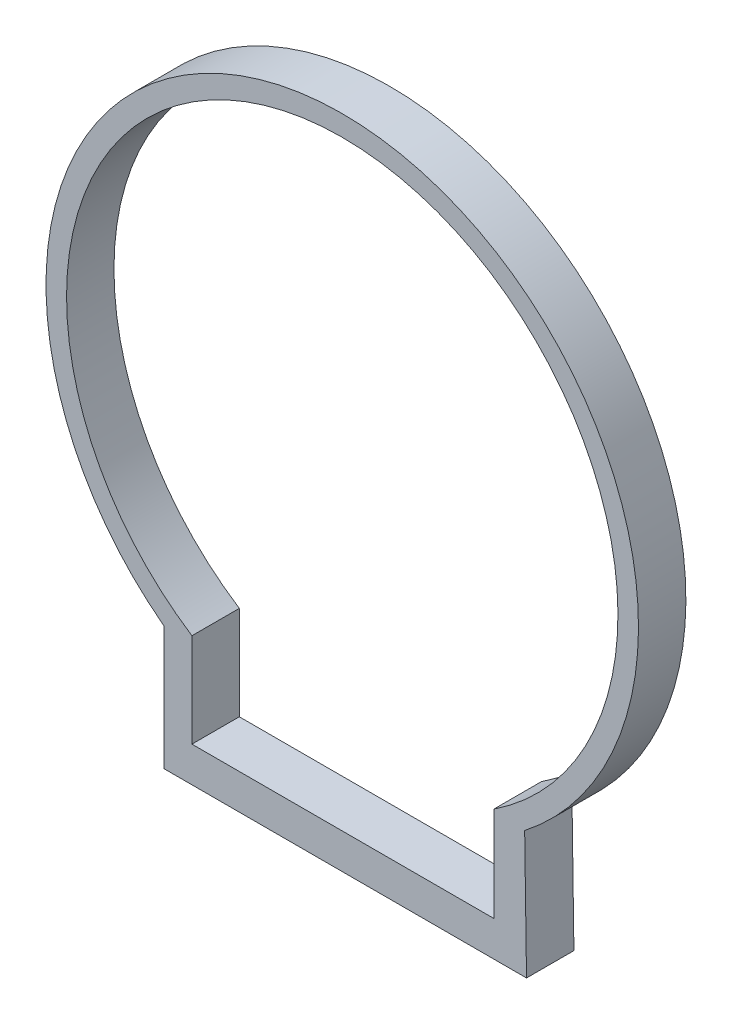
ISO-10303-21;
HEADER;
FILE_DESCRIPTION(('STEP AP214'),'2;1');
FILE_NAME('part.step','',(''),(''),'','','');
FILE_SCHEMA(('AUTOMOTIVE_DESIGN { 1 0 10303 214 1 1 1 1 }'));
ENDSEC;
DATA;
#1=APPLICATION_CONTEXT('core data for automotive mechanical design processes');
#2=APPLICATION_PROTOCOL_DEFINITION('international standard','automotive_design',2000,#1);
#3=PRODUCT_CONTEXT('',#1,'mechanical');
#4=PRODUCT('Part','Part','',(#3));
#5=PRODUCT_RELATED_PRODUCT_CATEGORY('part','',(#4));
#6=PRODUCT_DEFINITION_FORMATION('','',#4);
#7=PRODUCT_DEFINITION_CONTEXT('part definition',#1,'design');
#8=PRODUCT_DEFINITION('design','',#6,#7);
#9=PRODUCT_DEFINITION_SHAPE('','',#8);
#10=(LENGTH_UNIT() NAMED_UNIT(*) SI_UNIT(.MILLI.,.METRE.));
#11=(NAMED_UNIT(*) PLANE_ANGLE_UNIT() SI_UNIT($,.RADIAN.));
#12=(NAMED_UNIT(*) SI_UNIT($,.STERADIAN.) SOLID_ANGLE_UNIT());
#13=UNCERTAINTY_MEASURE_WITH_UNIT(LENGTH_MEASURE(1.E-05),#10,'distance_accuracy_value','');
#14=(GEOMETRIC_REPRESENTATION_CONTEXT(3) GLOBAL_UNCERTAINTY_ASSIGNED_CONTEXT((#13)) GLOBAL_UNIT_ASSIGNED_CONTEXT((#10,
#11,#12)) REPRESENTATION_CONTEXT('',''));
#15=CARTESIAN_POINT('',(0.,0.,0.));
#16=DIRECTION('',(0.,0.,1.));
#17=DIRECTION('',(1.,0.,0.));
#18=AXIS2_PLACEMENT_3D('',#15,#16,#17);
#19=CARTESIAN_POINT('',(0.,0.,3.));
#20=DIRECTION('',(0.,0.,-1.));
#21=DIRECTION('',(-1.,0.,0.));
#22=AXIS2_PLACEMENT_3D('',#19,#20,#21);
#23=CYLINDRICAL_SURFACE('',#22,18.75);
#24=CARTESIAN_POINT('',(0.,0.,0.));
#25=DIRECTION('',(0.,0.,1.));
#26=DIRECTION('',(-1.,0.,0.));
#27=AXIS2_PLACEMENT_3D('',#24,#25,#26);
#28=CIRCLE('',#27,18.75);
#29=CARTESIAN_POINT('',(11.5453145629285,-14.773903060567,0.));
#30=VERTEX_POINT('',#29);
#31=CARTESIAN_POINT('',(-11.287222979962,-14.9720104662205,0.));
#32=VERTEX_POINT('',#31);
#33=EDGE_CURVE('E124',#30,#32,#28,.T.);
#34=ORIENTED_EDGE('',*,*,#33,.T.);
#35=DIRECTION('',(0.,0.,-1.));
#36=VECTOR('',#35,1.);
#37=CARTESIAN_POINT('',(-11.287222979962,-14.9720104662205,3.));
#38=LINE('',#37,#36);
#39=CARTESIAN_POINT('',(-11.287222979962,-14.9720104662205,3.));
#40=VERTEX_POINT('',#39);
#41=EDGE_CURVE('E11',#40,#32,#38,.T.);
#42=ORIENTED_EDGE('',*,*,#41,.F.);
#43=CARTESIAN_POINT('',(0.,0.,3.));
#44=DIRECTION('',(0.,0.,1.));
#45=DIRECTION('',(-1.,0.,0.));
#46=AXIS2_PLACEMENT_3D('',#43,#44,#45);
#47=CIRCLE('',#46,18.75);
#48=CARTESIAN_POINT('',(11.5453145629285,-14.773903060567,3.));
#49=VERTEX_POINT('',#48);
#50=EDGE_CURVE('E156',#49,#40,#47,.T.);
#51=ORIENTED_EDGE('',*,*,#50,.F.);
#52=DIRECTION('',(0.,0.,-1.));
#53=VECTOR('',#52,1.);
#54=CARTESIAN_POINT('',(11.5453145629285,-14.773903060567,3.));
#55=LINE('',#54,#53);
#56=EDGE_CURVE('E170',#49,#30,#55,.T.);
#57=ORIENTED_EDGE('',*,*,#56,.T.);
#58=EDGE_LOOP('',(#34,#42,#51,#57));
#59=FACE_BOUND('',#58,.T.);
#60=ADVANCED_FACE('F41',(#59),#23,.T.);
#61=CARTESIAN_POINT('',(-11.287222979962,-14.9720104662205,3.));
#62=DIRECTION('',(1.,0.,0.));
#63=DIRECTION('',(0.,0.,-1.));
#64=AXIS2_PLACEMENT_3D('',#61,#62,#63);
#65=PLANE('',#64);
#66=DIRECTION('',(0.,-1.,0.));
#67=VECTOR('',#66,1.);
#68=CARTESIAN_POINT('',(-11.287222979962,-14.9720104662205,0.));
#69=LINE('',#68,#67);
#70=CARTESIAN_POINT('',(-11.287222979962,-22.8,0.));
#71=VERTEX_POINT('',#70);
#72=EDGE_CURVE('E174',#32,#71,#69,.T.);
#73=ORIENTED_EDGE('',*,*,#72,.T.);
#74=DIRECTION('',(0.,0.,-1.));
#75=VECTOR('',#74,1.);
#76=CARTESIAN_POINT('',(-11.287222979962,-22.8,3.));
#77=LINE('',#76,#75);
#78=CARTESIAN_POINT('',(-11.287222979962,-22.8,3.));
#79=VERTEX_POINT('',#78);
#80=EDGE_CURVE('E49',#79,#71,#77,.T.);
#81=ORIENTED_EDGE('',*,*,#80,.F.);
#82=DIRECTION('',(0.,-1.,0.));
#83=VECTOR('',#82,1.);
#84=CARTESIAN_POINT('',(-11.287222979962,-14.9720104662205,3.));
#85=LINE('',#84,#83);
#86=EDGE_CURVE('E160',#40,#79,#85,.T.);
#87=ORIENTED_EDGE('',*,*,#86,.F.);
#88=ORIENTED_EDGE('',*,*,#41,.T.);
#89=EDGE_LOOP('',(#73,#81,#87,#88));
#90=FACE_BOUND('',#89,.T.);
#91=ADVANCED_FACE('F197',(#90),#65,.F.);
#92=CARTESIAN_POINT('',(11.662777020038,-22.8,3.));
#93=DIRECTION('',(0.,1.,0.));
#94=DIRECTION('',(-1.,0.,0.));
#95=AXIS2_PLACEMENT_3D('',#92,#93,#94);
#96=PLANE('',#95);
#97=DIRECTION('',(1.,0.,0.));
#98=VECTOR('',#97,1.);
#99=CARTESIAN_POINT('',(11.662777020038,-22.8,0.));
#100=LINE('',#99,#98);
#101=CARTESIAN_POINT('',(11.662777020038,-22.8,0.));
#102=VERTEX_POINT('',#101);
#103=EDGE_CURVE('E178',#71,#102,#100,.T.);
#104=ORIENTED_EDGE('',*,*,#103,.T.);
#105=DIRECTION('',(0.,0.,-1.));
#106=VECTOR('',#105,1.);
#107=CARTESIAN_POINT('',(11.662777020038,-22.8,3.));
#108=LINE('',#107,#106);
#109=CARTESIAN_POINT('',(11.662777020038,-22.8,3.));
#110=VERTEX_POINT('',#109);
#111=EDGE_CURVE('E186',#110,#102,#108,.T.);
#112=ORIENTED_EDGE('',*,*,#111,.F.);
#113=DIRECTION('',(1.,0.,0.));
#114=VECTOR('',#113,1.);
#115=CARTESIAN_POINT('',(0.187777020037971,-22.8,3.));
#116=LINE('',#115,#114);
#117=EDGE_CURVE('E164',#79,#110,#116,.T.);
#118=ORIENTED_EDGE('',*,*,#117,.F.);
#119=ORIENTED_EDGE('',*,*,#80,.T.);
#120=EDGE_LOOP('',(#104,#112,#118,#119));
#121=FACE_BOUND('',#120,.T.);
#122=ADVANCED_FACE('F194',(#121),#96,.F.);
#123=CARTESIAN_POINT('',(11.662777020038,-22.8,3.));
#124=DIRECTION('',(-0.999892924624157,-0.0146334987801674,0.));
#125=DIRECTION('',(0.0146334987801674,-0.999892924624158,0.));
#126=AXIS2_PLACEMENT_3D('',#123,#124,#125);
#127=PLANE('',#126);
#128=DIRECTION('',(-0.0146334987801674,0.999892924624157,0.));
#129=VECTOR('',#128,1.);
#130=CARTESIAN_POINT('',(11.662777020038,-22.8,0.));
#131=LINE('',#130,#129);
#132=EDGE_CURVE('E161',#102,#30,#131,.T.);
#133=ORIENTED_EDGE('',*,*,#132,.T.);
#134=ORIENTED_EDGE('',*,*,#56,.F.);
#135=DIRECTION('',(-0.0146334987801674,0.999892924624157,0.));
#136=VECTOR('',#135,1.);
#137=CARTESIAN_POINT('',(11.662777020038,-22.8,3.));
#138=LINE('',#137,#136);
#139=EDGE_CURVE('E167',#110,#49,#138,.T.);
#140=ORIENTED_EDGE('',*,*,#139,.F.);
#141=ORIENTED_EDGE('',*,*,#111,.T.);
#142=EDGE_LOOP('',(#133,#134,#140,#141));
#143=FACE_BOUND('',#142,.T.);
#144=ADVANCED_FACE('F205',(#143),#127,.F.);
#145=CARTESIAN_POINT('',(0.,0.,3.));
#146=DIRECTION('',(0.,0.,-1.));
#147=DIRECTION('',(-1.,0.,0.));
#148=AXIS2_PLACEMENT_3D('',#145,#146,#147);
#149=PLANE('',#148);
#150=DIRECTION('',(0.,-1.,0.));
#151=VECTOR('',#150,1.);
#152=CARTESIAN_POINT('',(-9.51483036329046,-20.5703448516234,3.));
#153=LINE('',#152,#151);
#154=CARTESIAN_POINT('',(-9.51483036329044,-14.6277306222738,3.));
#155=VERTEX_POINT('',#154);
#156=CARTESIAN_POINT('',(-9.51483036329046,-20.5703448516234,3.));
#157=VERTEX_POINT('',#156);
#158=EDGE_CURVE('E106',#155,#157,#153,.T.);
#159=ORIENTED_EDGE('',*,*,#158,.F.);
#160=CARTESIAN_POINT('',(0.,0.,3.));
#161=DIRECTION('',(0.,0.,1.));
#162=DIRECTION('',(-1.,0.,0.));
#163=AXIS2_PLACEMENT_3D('',#160,#161,#162);
#164=CIRCLE('',#163,17.45);
#165=CARTESIAN_POINT('',(9.59368517655902,-14.5761347665652,3.));
#166=VERTEX_POINT('',#165);
#167=EDGE_CURVE('E134',#166,#155,#164,.T.);
#168=ORIENTED_EDGE('',*,*,#167,.F.);
#169=DIRECTION('',(0.,1.,0.));
#170=VECTOR('',#169,1.);
#171=CARTESIAN_POINT('',(9.59368517655902,-14.5761347665652,3.));
#172=LINE('',#171,#170);
#173=CARTESIAN_POINT('',(9.59368517655902,-20.5703448516234,3.));
#174=VERTEX_POINT('',#173);
#175=EDGE_CURVE('E130',#174,#166,#172,.T.);
#176=ORIENTED_EDGE('',*,*,#175,.F.);
#177=DIRECTION('',(1.,0.,0.));
#178=VECTOR('',#177,1.);
#179=CARTESIAN_POINT('',(9.59368517655902,-20.5703448516234,3.));
#180=LINE('',#179,#178);
#181=EDGE_CURVE('E115',#157,#174,#180,.T.);
#182=ORIENTED_EDGE('',*,*,#181,.F.);
#183=EDGE_LOOP('',(#159,#168,#176,#182));
#184=FACE_BOUND('',#183,.T.);
#185=ORIENTED_EDGE('',*,*,#50,.T.);
#186=ORIENTED_EDGE('',*,*,#86,.T.);
#187=ORIENTED_EDGE('',*,*,#117,.T.);
#188=ORIENTED_EDGE('',*,*,#139,.T.);
#189=EDGE_LOOP('',(#185,#186,#187,#188));
#190=FACE_BOUND('',#189,.T.);
#191=ADVANCED_FACE('F128',(#184,#190),#149,.F.);
#192=CARTESIAN_POINT('',(0.,0.,0.));
#193=DIRECTION('',(0.,0.,-1.));
#194=DIRECTION('',(-1.,0.,0.));
#195=AXIS2_PLACEMENT_3D('',#192,#193,#194);
#196=PLANE('',#195);
#197=CARTESIAN_POINT('',(0.,0.,0.));
#198=DIRECTION('',(0.,0.,1.));
#199=DIRECTION('',(-1.,0.,0.));
#200=AXIS2_PLACEMENT_3D('',#197,#198,#199);
#201=CIRCLE('',#200,17.45);
#202=CARTESIAN_POINT('',(9.59368517655902,-14.5761347665652,0.));
#203=VERTEX_POINT('',#202);
#204=CARTESIAN_POINT('',(-9.51483036329044,-14.6277306222738,0.));
#205=VERTEX_POINT('',#204);
#206=EDGE_CURVE('E116',#203,#205,#201,.T.);
#207=ORIENTED_EDGE('',*,*,#206,.T.);
#208=DIRECTION('',(0.,-1.,0.));
#209=VECTOR('',#208,1.);
#210=CARTESIAN_POINT('',(-9.51483036329046,-20.5703448516234,0.));
#211=LINE('',#210,#209);
#212=CARTESIAN_POINT('',(-9.51483036329046,-20.5703448516234,0.));
#213=VERTEX_POINT('',#212);
#214=EDGE_CURVE('E64',#205,#213,#211,.T.);
#215=ORIENTED_EDGE('',*,*,#214,.T.);
#216=DIRECTION('',(1.,0.,0.));
#217=VECTOR('',#216,1.);
#218=CARTESIAN_POINT('',(9.59368517655902,-20.5703448516234,0.));
#219=LINE('',#218,#217);
#220=CARTESIAN_POINT('',(9.59368517655902,-20.5703448516234,0.));
#221=VERTEX_POINT('',#220);
#222=EDGE_CURVE('E122',#213,#221,#219,.T.);
#223=ORIENTED_EDGE('',*,*,#222,.T.);
#224=DIRECTION('',(0.,1.,0.));
#225=VECTOR('',#224,1.);
#226=CARTESIAN_POINT('',(9.59368517655902,-14.5761347665652,0.));
#227=LINE('',#226,#225);
#228=EDGE_CURVE('E143',#221,#203,#227,.T.);
#229=ORIENTED_EDGE('',*,*,#228,.T.);
#230=EDGE_LOOP('',(#207,#215,#223,#229));
#231=FACE_BOUND('',#230,.T.);
#232=ORIENTED_EDGE('',*,*,#33,.F.);
#233=ORIENTED_EDGE('',*,*,#132,.F.);
#234=ORIENTED_EDGE('',*,*,#103,.F.);
#235=ORIENTED_EDGE('',*,*,#72,.F.);
#236=EDGE_LOOP('',(#232,#233,#234,#235));
#237=FACE_BOUND('',#236,.T.);
#238=ADVANCED_FACE('F201',(#231,#237),#196,.T.);
#239=CARTESIAN_POINT('',(-9.51483036329046,-20.5703448516234,3.));
#240=DIRECTION('',(1.,0.,0.));
#241=DIRECTION('',(0.,0.,-1.));
#242=AXIS2_PLACEMENT_3D('',#239,#240,#241);
#243=PLANE('',#242);
#244=ORIENTED_EDGE('',*,*,#214,.F.);
#245=DIRECTION('',(0.,0.,-1.));
#246=VECTOR('',#245,1.);
#247=CARTESIAN_POINT('',(-9.51483036329044,-14.6277306222738,3.));
#248=LINE('',#247,#246);
#249=EDGE_CURVE('E110',#155,#205,#248,.T.);
#250=ORIENTED_EDGE('',*,*,#249,.F.);
#251=ORIENTED_EDGE('',*,*,#158,.T.);
#252=DIRECTION('',(0.,0.,-1.));
#253=VECTOR('',#252,1.);
#254=CARTESIAN_POINT('',(-9.51483036329046,-20.5703448516234,3.));
#255=LINE('',#254,#253);
#256=EDGE_CURVE('E109',#157,#213,#255,.T.);
#257=ORIENTED_EDGE('',*,*,#256,.T.);
#258=EDGE_LOOP('',(#244,#250,#251,#257));
#259=FACE_BOUND('',#258,.T.);
#260=ADVANCED_FACE('F108',(#259),#243,.T.);
#261=CARTESIAN_POINT('',(9.59368517655902,-20.5703448516234,3.));
#262=DIRECTION('',(0.,1.,0.));
#263=DIRECTION('',(0.,0.,1.));
#264=AXIS2_PLACEMENT_3D('',#261,#262,#263);
#265=PLANE('',#264);
#266=ORIENTED_EDGE('',*,*,#222,.F.);
#267=ORIENTED_EDGE('',*,*,#256,.F.);
#268=ORIENTED_EDGE('',*,*,#181,.T.);
#269=DIRECTION('',(0.,0.,-1.));
#270=VECTOR('',#269,1.);
#271=CARTESIAN_POINT('',(9.59368517655902,-20.5703448516234,3.));
#272=LINE('',#271,#270);
#273=EDGE_CURVE('E125',#174,#221,#272,.T.);
#274=ORIENTED_EDGE('',*,*,#273,.T.);
#275=EDGE_LOOP('',(#266,#267,#268,#274));
#276=FACE_BOUND('',#275,.T.);
#277=ADVANCED_FACE('F119',(#276),#265,.T.);
#278=CARTESIAN_POINT('',(9.59368517655902,-14.5761347665652,3.));
#279=DIRECTION('',(-1.,0.,0.));
#280=DIRECTION('',(0.,0.,1.));
#281=AXIS2_PLACEMENT_3D('',#278,#279,#280);
#282=PLANE('',#281);
#283=ORIENTED_EDGE('',*,*,#228,.F.);
#284=ORIENTED_EDGE('',*,*,#273,.F.);
#285=ORIENTED_EDGE('',*,*,#175,.T.);
#286=DIRECTION('',(0.,0.,-1.));
#287=VECTOR('',#286,1.);
#288=CARTESIAN_POINT('',(9.59368517655902,-14.5761347665652,3.));
#289=LINE('',#288,#287);
#290=EDGE_CURVE('E56',#166,#203,#289,.T.);
#291=ORIENTED_EDGE('',*,*,#290,.T.);
#292=EDGE_LOOP('',(#283,#284,#285,#291));
#293=FACE_BOUND('',#292,.T.);
#294=ADVANCED_FACE('F259',(#293),#282,.T.);
#295=CARTESIAN_POINT('',(0.,0.,3.));
#296=DIRECTION('',(0.,0.,-1.));
#297=DIRECTION('',(-1.,0.,0.));
#298=AXIS2_PLACEMENT_3D('',#295,#296,#297);
#299=CYLINDRICAL_SURFACE('',#298,17.45);
#300=ORIENTED_EDGE('',*,*,#206,.F.);
#301=ORIENTED_EDGE('',*,*,#290,.F.);
#302=ORIENTED_EDGE('',*,*,#167,.T.);
#303=ORIENTED_EDGE('',*,*,#249,.T.);
#304=EDGE_LOOP('',(#300,#301,#302,#303));
#305=FACE_BOUND('',#304,.T.);
#306=ADVANCED_FACE('F268',(#305),#299,.F.);
#307=CLOSED_SHELL('',(#60,#91,#122,#144,#191,#238,#260,#277,#294,#306));
#308=MANIFOLD_SOLID_BREP('B2',#307);
#309=ADVANCED_BREP_SHAPE_REPRESENTATION('',(#18,#308),#14);
#310=SHAPE_DEFINITION_REPRESENTATION(#9,#309);
ENDSEC;
END-ISO-10303-21;
